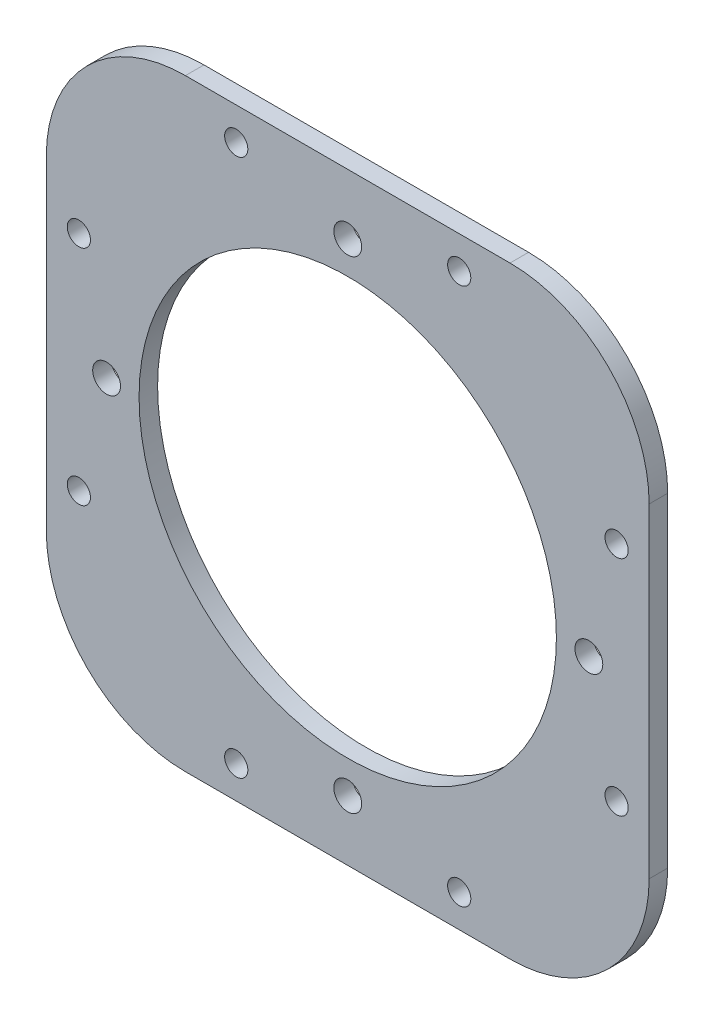
ISO-10303-21;
HEADER;
FILE_DESCRIPTION(('STEP AP214'),'2;1');
FILE_NAME('part.step','',(''),(''),'','','');
FILE_SCHEMA(('AUTOMOTIVE_DESIGN { 1 0 10303 214 1 1 1 1 }'));
ENDSEC;
DATA;
#1=APPLICATION_CONTEXT('core data for automotive mechanical design processes');
#2=APPLICATION_PROTOCOL_DEFINITION('international standard','automotive_design',2000,#1);
#3=PRODUCT_CONTEXT('',#1,'mechanical');
#4=PRODUCT('Part','Part','',(#3));
#5=PRODUCT_RELATED_PRODUCT_CATEGORY('part','',(#4));
#6=PRODUCT_DEFINITION_FORMATION('','',#4);
#7=PRODUCT_DEFINITION_CONTEXT('part definition',#1,'design');
#8=PRODUCT_DEFINITION('design','',#6,#7);
#9=PRODUCT_DEFINITION_SHAPE('','',#8);
#10=(LENGTH_UNIT() NAMED_UNIT(*) SI_UNIT(.MILLI.,.METRE.));
#11=(NAMED_UNIT(*) PLANE_ANGLE_UNIT() SI_UNIT($,.RADIAN.));
#12=(NAMED_UNIT(*) SI_UNIT($,.STERADIAN.) SOLID_ANGLE_UNIT());
#13=UNCERTAINTY_MEASURE_WITH_UNIT(LENGTH_MEASURE(1.E-05),#10,'distance_accuracy_value','');
#14=(GEOMETRIC_REPRESENTATION_CONTEXT(3) GLOBAL_UNCERTAINTY_ASSIGNED_CONTEXT((#13)) GLOBAL_UNIT_ASSIGNED_CONTEXT((#10,
#11,#12)) REPRESENTATION_CONTEXT('',''));
#15=CARTESIAN_POINT('',(0.,0.,0.));
#16=DIRECTION('',(0.,0.,1.));
#17=DIRECTION('',(1.,0.,0.));
#18=AXIS2_PLACEMENT_3D('',#15,#16,#17);
#19=CARTESIAN_POINT('',(0.,0.,2.));
#20=DIRECTION('',(0.,0.,1.));
#21=DIRECTION('',(1.,0.,0.));
#22=AXIS2_PLACEMENT_3D('',#19,#20,#21);
#23=PLANE('',#22);
#24=CARTESIAN_POINT('',(-28.9913780286489,12.0208152801702,2.));
#25=DIRECTION('',(0.,0.,1.));
#26=DIRECTION('',(1.,0.,0.));
#27=AXIS2_PLACEMENT_3D('',#24,#25,#26);
#28=CIRCLE('',#27,1.25000000000119);
#29=CARTESIAN_POINT('',(-27.7413780286477,12.0208152801702,2.));
#30=VERTEX_POINT('',#29);
#31=EDGE_CURVE('E244',#30,#30,#28,.T.);
#32=ORIENTED_EDGE('',*,*,#31,.F.);
#33=EDGE_LOOP('',(#32));
#34=FACE_BOUND('',#33,.T.);
#35=CARTESIAN_POINT('',(-12.0208152801707,-28.9913780286501,2.));
#36=DIRECTION('',(0.,0.,1.));
#37=DIRECTION('',(1.,0.,0.));
#38=AXIS2_PLACEMENT_3D('',#35,#36,#37);
#39=CIRCLE('',#38,1.25000000000031);
#40=CARTESIAN_POINT('',(-10.7708152801703,-28.9913780286501,2.));
#41=VERTEX_POINT('',#40);
#42=EDGE_CURVE('E232',#41,#41,#39,.T.);
#43=ORIENTED_EDGE('',*,*,#42,.F.);
#44=EDGE_LOOP('',(#43));
#45=FACE_BOUND('',#44,.T.);
#46=CARTESIAN_POINT('',(28.9913780286496,-12.0208152801718,2.));
#47=DIRECTION('',(0.,0.,1.));
#48=DIRECTION('',(1.,0.,0.));
#49=AXIS2_PLACEMENT_3D('',#46,#47,#48);
#50=CIRCLE('',#49,1.24999999999928);
#51=CARTESIAN_POINT('',(30.2413780286489,-12.0208152801718,2.));
#52=VERTEX_POINT('',#51);
#53=EDGE_CURVE('E220',#52,#52,#50,.T.);
#54=ORIENTED_EDGE('',*,*,#53,.F.);
#55=EDGE_LOOP('',(#54));
#56=FACE_BOUND('',#55,.T.);
#57=CARTESIAN_POINT('',(12.0208152801713,28.9913780286484,2.));
#58=DIRECTION('',(0.,0.,1.));
#59=DIRECTION('',(1.,0.,0.));
#60=AXIS2_PLACEMENT_3D('',#57,#58,#59);
#61=CIRCLE('',#60,1.25);
#62=CARTESIAN_POINT('',(13.2708152801713,28.9913780286484,2.));
#63=VERTEX_POINT('',#62);
#64=EDGE_CURVE('E208',#63,#63,#61,.T.);
#65=ORIENTED_EDGE('',*,*,#64,.F.);
#66=EDGE_LOOP('',(#65));
#67=FACE_BOUND('',#66,.T.);
#68=CARTESIAN_POINT('',(1.21956773276677E-12,-26.,2.));
#69=DIRECTION('',(0.,0.,1.));
#70=DIRECTION('',(1.,0.,0.));
#71=AXIS2_PLACEMENT_3D('',#68,#69,#70);
#72=CIRCLE('',#71,1.5);
#73=CARTESIAN_POINT('',(1.50000000000122,-26.,2.));
#74=VERTEX_POINT('',#73);
#75=EDGE_CURVE('E196',#74,#74,#72,.T.);
#76=ORIENTED_EDGE('',*,*,#75,.F.);
#77=EDGE_LOOP('',(#76));
#78=FACE_BOUND('',#77,.T.);
#79=CARTESIAN_POINT('',(0.,26.,2.));
#80=DIRECTION('',(0.,0.,1.));
#81=DIRECTION('',(1.,0.,0.));
#82=AXIS2_PLACEMENT_3D('',#79,#80,#81);
#83=CIRCLE('',#82,1.5);
#84=CARTESIAN_POINT('',(1.49999999999998,26.,2.));
#85=VERTEX_POINT('',#84);
#86=EDGE_CURVE('E185',#85,#85,#83,.T.);
#87=ORIENTED_EDGE('',*,*,#86,.F.);
#88=EDGE_LOOP('',(#87));
#89=FACE_BOUND('',#88,.T.);
#90=DIRECTION('',(1.,0.,0.));
#91=VECTOR('',#90,1.);
#92=CARTESIAN_POINT('',(32.5,-32.5,2.));
#93=LINE('',#92,#91);
#94=CARTESIAN_POINT('',(-17.5,-32.5,2.));
#95=VERTEX_POINT('',#94);
#96=CARTESIAN_POINT('',(17.5,-32.5,2.));
#97=VERTEX_POINT('',#96);
#98=EDGE_CURVE('E170',#95,#97,#93,.T.);
#99=ORIENTED_EDGE('',*,*,#98,.T.);
#100=CARTESIAN_POINT('',(17.5,-17.5,2.));
#101=DIRECTION('',(0.,0.,1.));
#102=DIRECTION('',(1.,0.,0.));
#103=AXIS2_PLACEMENT_3D('',#100,#101,#102);
#104=CIRCLE('',#103,15.);
#105=CARTESIAN_POINT('',(32.5,-17.5,2.));
#106=VERTEX_POINT('',#105);
#107=EDGE_CURVE('E150',#97,#106,#104,.T.);
#108=ORIENTED_EDGE('',*,*,#107,.T.);
#109=DIRECTION('',(0.,1.,0.));
#110=VECTOR('',#109,1.);
#111=CARTESIAN_POINT('',(32.5,-32.5,2.));
#112=LINE('',#111,#110);
#113=CARTESIAN_POINT('',(32.5,17.5,2.));
#114=VERTEX_POINT('',#113);
#115=EDGE_CURVE('E120',#106,#114,#112,.T.);
#116=ORIENTED_EDGE('',*,*,#115,.T.);
#117=CARTESIAN_POINT('',(17.5,17.5,2.));
#118=DIRECTION('',(0.,0.,1.));
#119=DIRECTION('',(1.,0.,0.));
#120=AXIS2_PLACEMENT_3D('',#117,#118,#119);
#121=CIRCLE('',#120,15.);
#122=CARTESIAN_POINT('',(17.5,32.5,2.));
#123=VERTEX_POINT('',#122);
#124=EDGE_CURVE('E56',#114,#123,#121,.T.);
#125=ORIENTED_EDGE('',*,*,#124,.T.);
#126=DIRECTION('',(-1.,0.,0.));
#127=VECTOR('',#126,1.);
#128=CARTESIAN_POINT('',(32.5,32.5,2.));
#129=LINE('',#128,#127);
#130=CARTESIAN_POINT('',(-17.5,32.5,2.));
#131=VERTEX_POINT('',#130);
#132=EDGE_CURVE('E137',#123,#131,#129,.T.);
#133=ORIENTED_EDGE('',*,*,#132,.T.);
#134=CARTESIAN_POINT('',(-17.5,17.5,2.));
#135=DIRECTION('',(0.,0.,1.));
#136=DIRECTION('',(1.,0.,0.));
#137=AXIS2_PLACEMENT_3D('',#134,#135,#136);
#138=CIRCLE('',#137,15.);
#139=CARTESIAN_POINT('',(-32.5,17.5,2.));
#140=VERTEX_POINT('',#139);
#141=EDGE_CURVE('E145',#131,#140,#138,.T.);
#142=ORIENTED_EDGE('',*,*,#141,.T.);
#143=DIRECTION('',(0.,-1.,0.));
#144=VECTOR('',#143,1.);
#145=CARTESIAN_POINT('',(-32.5,-32.5,2.));
#146=LINE('',#145,#144);
#147=CARTESIAN_POINT('',(-32.5,-17.5,2.));
#148=VERTEX_POINT('',#147);
#149=EDGE_CURVE('E131',#140,#148,#146,.T.);
#150=ORIENTED_EDGE('',*,*,#149,.T.);
#151=CARTESIAN_POINT('',(-17.5,-17.5,2.));
#152=DIRECTION('',(0.,0.,1.));
#153=DIRECTION('',(1.,0.,0.));
#154=AXIS2_PLACEMENT_3D('',#151,#152,#153);
#155=CIRCLE('',#154,15.);
#156=EDGE_CURVE('E148',#148,#95,#155,.T.);
#157=ORIENTED_EDGE('',*,*,#156,.T.);
#158=EDGE_LOOP('',(#99,#108,#116,#125,#133,#142,#150,#157));
#159=FACE_BOUND('',#158,.T.);
#160=CARTESIAN_POINT('',(0.,0.,2.));
#161=DIRECTION('',(0.,0.,1.));
#162=DIRECTION('',(1.,0.,0.));
#163=AXIS2_PLACEMENT_3D('',#160,#161,#162);
#164=CIRCLE('',#163,22.5);
#165=CARTESIAN_POINT('',(22.5,0.,2.));
#166=VERTEX_POINT('',#165);
#167=EDGE_CURVE('E176',#166,#166,#164,.T.);
#168=ORIENTED_EDGE('',*,*,#167,.F.);
#169=EDGE_LOOP('',(#168));
#170=FACE_BOUND('',#169,.T.);
#171=CARTESIAN_POINT('',(26.0000000000006,6.19949510421736E-13,2.));
#172=DIRECTION('',(0.,0.,1.));
#173=DIRECTION('',(1.,0.,0.));
#174=AXIS2_PLACEMENT_3D('',#171,#172,#173);
#175=CIRCLE('',#174,1.5);
#176=CARTESIAN_POINT('',(27.5000000000006,6.19949510421736E-13,2.));
#177=VERTEX_POINT('',#176);
#178=EDGE_CURVE('E190',#177,#177,#175,.T.);
#179=ORIENTED_EDGE('',*,*,#178,.F.);
#180=EDGE_LOOP('',(#179));
#181=FACE_BOUND('',#180,.T.);
#182=CARTESIAN_POINT('',(-25.9999999999994,-6.23133592099519E-13,2.));
#183=DIRECTION('',(0.,0.,1.));
#184=DIRECTION('',(1.,0.,0.));
#185=AXIS2_PLACEMENT_3D('',#182,#183,#184);
#186=CIRCLE('',#185,1.5);
#187=CARTESIAN_POINT('',(-24.4999999999994,-6.23133592099519E-13,2.));
#188=VERTEX_POINT('',#187);
#189=EDGE_CURVE('E202',#188,#188,#186,.T.);
#190=ORIENTED_EDGE('',*,*,#189,.F.);
#191=EDGE_LOOP('',(#190));
#192=FACE_BOUND('',#191,.T.);
#193=CARTESIAN_POINT('',(28.9913780286485,12.0208152801713,2.));
#194=DIRECTION('',(0.,0.,1.));
#195=DIRECTION('',(-1.,0.,0.));
#196=AXIS2_PLACEMENT_3D('',#193,#194,#195);
#197=CIRCLE('',#196,1.24999999999999);
#198=CARTESIAN_POINT('',(27.7413780286485,12.0208152801713,2.));
#199=VERTEX_POINT('',#198);
#200=EDGE_CURVE('E214',#199,#199,#197,.T.);
#201=ORIENTED_EDGE('',*,*,#200,.F.);
#202=EDGE_LOOP('',(#201));
#203=FACE_BOUND('',#202,.T.);
#204=CARTESIAN_POINT('',(12.0208152801724,-28.9913780286489,2.));
#205=DIRECTION('',(0.,0.,1.));
#206=DIRECTION('',(-1.,0.,0.));
#207=AXIS2_PLACEMENT_3D('',#204,#205,#206);
#208=CIRCLE('',#207,1.24999999999869);
#209=CARTESIAN_POINT('',(10.7708152801738,-28.9913780286489,2.));
#210=VERTEX_POINT('',#209);
#211=EDGE_CURVE('E226',#210,#210,#208,.T.);
#212=ORIENTED_EDGE('',*,*,#211,.F.);
#213=EDGE_LOOP('',(#212));
#214=FACE_BOUND('',#213,.T.);
#215=CARTESIAN_POINT('',(-28.9913780286478,-12.0208152801729,2.));
#216=DIRECTION('',(0.,0.,1.));
#217=DIRECTION('',(-1.,0.,0.));
#218=AXIS2_PLACEMENT_3D('',#215,#216,#217);
#219=CIRCLE('',#218,1.24999999999846);
#220=CARTESIAN_POINT('',(-30.2413780286463,-12.0208152801729,2.));
#221=VERTEX_POINT('',#220);
#222=EDGE_CURVE('E238',#221,#221,#219,.T.);
#223=ORIENTED_EDGE('',*,*,#222,.F.);
#224=EDGE_LOOP('',(#223));
#225=FACE_BOUND('',#224,.T.);
#226=CARTESIAN_POINT('',(-12.0208152801718,28.9913780286473,2.));
#227=DIRECTION('',(0.,0.,1.));
#228=DIRECTION('',(-1.,0.,0.));
#229=AXIS2_PLACEMENT_3D('',#226,#227,#228);
#230=CIRCLE('',#229,1.24999999999961);
#231=CARTESIAN_POINT('',(-13.2708152801714,28.9913780286473,2.));
#232=VERTEX_POINT('',#231);
#233=EDGE_CURVE('E250',#232,#232,#230,.T.);
#234=ORIENTED_EDGE('',*,*,#233,.F.);
#235=EDGE_LOOP('',(#234));
#236=FACE_BOUND('',#235,.T.);
#237=ADVANCED_FACE('F35',(#34,#45,#56,#67,#78,#89,#159,#170,#181,#192,#203,#214,#225,#236),#23,.T.);
#238=CARTESIAN_POINT('',(0.,0.,0.));
#239=DIRECTION('',(0.,0.,1.));
#240=DIRECTION('',(1.,0.,0.));
#241=AXIS2_PLACEMENT_3D('',#238,#239,#240);
#242=PLANE('',#241);
#243=DIRECTION('',(0.,1.,0.));
#244=VECTOR('',#243,1.);
#245=CARTESIAN_POINT('',(32.5,-32.5,0.));
#246=LINE('',#245,#244);
#247=CARTESIAN_POINT('',(32.5,-17.5,0.));
#248=VERTEX_POINT('',#247);
#249=CARTESIAN_POINT('',(32.5,17.5,0.));
#250=VERTEX_POINT('',#249);
#251=EDGE_CURVE('E118',#248,#250,#246,.T.);
#252=ORIENTED_EDGE('',*,*,#251,.F.);
#253=CARTESIAN_POINT('',(17.5,-17.5,0.));
#254=DIRECTION('',(0.,0.,1.));
#255=DIRECTION('',(1.,0.,0.));
#256=AXIS2_PLACEMENT_3D('',#253,#254,#255);
#257=CIRCLE('',#256,15.);
#258=CARTESIAN_POINT('',(17.5,-32.5,0.));
#259=VERTEX_POINT('',#258);
#260=EDGE_CURVE('E101',#248,#259,#257,.F.);
#261=ORIENTED_EDGE('',*,*,#260,.T.);
#262=DIRECTION('',(1.,0.,0.));
#263=VECTOR('',#262,1.);
#264=CARTESIAN_POINT('',(32.5,-32.5,0.));
#265=LINE('',#264,#263);
#266=CARTESIAN_POINT('',(-17.5,-32.5,0.));
#267=VERTEX_POINT('',#266);
#268=EDGE_CURVE('E129',#267,#259,#265,.T.);
#269=ORIENTED_EDGE('',*,*,#268,.F.);
#270=CARTESIAN_POINT('',(-17.5,-17.5,0.));
#271=DIRECTION('',(0.,0.,1.));
#272=DIRECTION('',(1.,0.,0.));
#273=AXIS2_PLACEMENT_3D('',#270,#271,#272);
#274=CIRCLE('',#273,15.);
#275=CARTESIAN_POINT('',(-32.5,-17.5,0.));
#276=VERTEX_POINT('',#275);
#277=EDGE_CURVE('E112',#267,#276,#274,.F.);
#278=ORIENTED_EDGE('',*,*,#277,.T.);
#279=DIRECTION('',(0.,-1.,0.));
#280=VECTOR('',#279,1.);
#281=CARTESIAN_POINT('',(-32.5,-32.5,0.));
#282=LINE('',#281,#280);
#283=CARTESIAN_POINT('',(-32.5,17.5,0.));
#284=VERTEX_POINT('',#283);
#285=EDGE_CURVE('E133',#284,#276,#282,.T.);
#286=ORIENTED_EDGE('',*,*,#285,.F.);
#287=CARTESIAN_POINT('',(-17.5,17.5,0.));
#288=DIRECTION('',(0.,0.,1.));
#289=DIRECTION('',(1.,0.,0.));
#290=AXIS2_PLACEMENT_3D('',#287,#288,#289);
#291=CIRCLE('',#290,15.);
#292=CARTESIAN_POINT('',(-17.5,32.5,0.));
#293=VERTEX_POINT('',#292);
#294=EDGE_CURVE('E121',#284,#293,#291,.F.);
#295=ORIENTED_EDGE('',*,*,#294,.T.);
#296=DIRECTION('',(-1.,0.,0.));
#297=VECTOR('',#296,1.);
#298=CARTESIAN_POINT('',(32.5,32.5,0.));
#299=LINE('',#298,#297);
#300=CARTESIAN_POINT('',(17.5,32.5,0.));
#301=VERTEX_POINT('',#300);
#302=EDGE_CURVE('E128',#301,#293,#299,.T.);
#303=ORIENTED_EDGE('',*,*,#302,.F.);
#304=CARTESIAN_POINT('',(17.5,17.5,0.));
#305=DIRECTION('',(0.,0.,1.));
#306=DIRECTION('',(1.,0.,0.));
#307=AXIS2_PLACEMENT_3D('',#304,#305,#306);
#308=CIRCLE('',#307,15.);
#309=EDGE_CURVE('E127',#301,#250,#308,.F.);
#310=ORIENTED_EDGE('',*,*,#309,.T.);
#311=EDGE_LOOP('',(#252,#261,#269,#278,#286,#295,#303,#310));
#312=FACE_BOUND('',#311,.T.);
#313=CARTESIAN_POINT('',(0.,0.,0.));
#314=DIRECTION('',(0.,0.,1.));
#315=DIRECTION('',(1.,0.,0.));
#316=AXIS2_PLACEMENT_3D('',#313,#314,#315);
#317=CIRCLE('',#316,22.5);
#318=CARTESIAN_POINT('',(22.5,0.,0.));
#319=VERTEX_POINT('',#318);
#320=EDGE_CURVE('E178',#319,#319,#317,.T.);
#321=ORIENTED_EDGE('',*,*,#320,.T.);
#322=EDGE_LOOP('',(#321));
#323=FACE_BOUND('',#322,.T.);
#324=CARTESIAN_POINT('',(0.,26.,0.));
#325=DIRECTION('',(0.,0.,1.));
#326=DIRECTION('',(1.,0.,0.));
#327=AXIS2_PLACEMENT_3D('',#324,#325,#326);
#328=CIRCLE('',#327,1.5);
#329=CARTESIAN_POINT('',(1.49999999999998,26.,0.));
#330=VERTEX_POINT('',#329);
#331=EDGE_CURVE('E187',#330,#330,#328,.T.);
#332=ORIENTED_EDGE('',*,*,#331,.T.);
#333=EDGE_LOOP('',(#332));
#334=FACE_BOUND('',#333,.T.);
#335=CARTESIAN_POINT('',(26.0000000000006,6.19949510421736E-13,0.));
#336=DIRECTION('',(0.,0.,1.));
#337=DIRECTION('',(1.,0.,0.));
#338=AXIS2_PLACEMENT_3D('',#335,#336,#337);
#339=CIRCLE('',#338,1.5);
#340=CARTESIAN_POINT('',(27.5000000000006,6.19949510421736E-13,0.));
#341=VERTEX_POINT('',#340);
#342=EDGE_CURVE('E193',#341,#341,#339,.T.);
#343=ORIENTED_EDGE('',*,*,#342,.T.);
#344=EDGE_LOOP('',(#343));
#345=FACE_BOUND('',#344,.T.);
#346=CARTESIAN_POINT('',(1.21956773276677E-12,-26.,0.));
#347=DIRECTION('',(0.,0.,1.));
#348=DIRECTION('',(1.,0.,0.));
#349=AXIS2_PLACEMENT_3D('',#346,#347,#348);
#350=CIRCLE('',#349,1.5);
#351=CARTESIAN_POINT('',(1.50000000000122,-26.,0.));
#352=VERTEX_POINT('',#351);
#353=EDGE_CURVE('E199',#352,#352,#350,.T.);
#354=ORIENTED_EDGE('',*,*,#353,.T.);
#355=EDGE_LOOP('',(#354));
#356=FACE_BOUND('',#355,.T.);
#357=CARTESIAN_POINT('',(-25.9999999999994,-6.23133592099519E-13,0.));
#358=DIRECTION('',(0.,0.,1.));
#359=DIRECTION('',(1.,0.,0.));
#360=AXIS2_PLACEMENT_3D('',#357,#358,#359);
#361=CIRCLE('',#360,1.5);
#362=CARTESIAN_POINT('',(-24.4999999999994,-6.23133592099519E-13,0.));
#363=VERTEX_POINT('',#362);
#364=EDGE_CURVE('E205',#363,#363,#361,.T.);
#365=ORIENTED_EDGE('',*,*,#364,.T.);
#366=EDGE_LOOP('',(#365));
#367=FACE_BOUND('',#366,.T.);
#368=CARTESIAN_POINT('',(12.0208152801713,28.9913780286484,0.));
#369=DIRECTION('',(0.,0.,1.));
#370=DIRECTION('',(1.,0.,0.));
#371=AXIS2_PLACEMENT_3D('',#368,#369,#370);
#372=CIRCLE('',#371,1.25);
#373=CARTESIAN_POINT('',(13.2708152801713,28.9913780286484,0.));
#374=VERTEX_POINT('',#373);
#375=EDGE_CURVE('E211',#374,#374,#372,.T.);
#376=ORIENTED_EDGE('',*,*,#375,.T.);
#377=EDGE_LOOP('',(#376));
#378=FACE_BOUND('',#377,.T.);
#379=CARTESIAN_POINT('',(28.9913780286485,12.0208152801713,0.));
#380=DIRECTION('',(0.,0.,1.));
#381=DIRECTION('',(-1.,0.,0.));
#382=AXIS2_PLACEMENT_3D('',#379,#380,#381);
#383=CIRCLE('',#382,1.24999999999999);
#384=CARTESIAN_POINT('',(27.7413780286485,12.0208152801713,0.));
#385=VERTEX_POINT('',#384);
#386=EDGE_CURVE('E217',#385,#385,#383,.T.);
#387=ORIENTED_EDGE('',*,*,#386,.T.);
#388=EDGE_LOOP('',(#387));
#389=FACE_BOUND('',#388,.T.);
#390=CARTESIAN_POINT('',(28.9913780286496,-12.0208152801718,0.));
#391=DIRECTION('',(0.,0.,1.));
#392=DIRECTION('',(1.,0.,0.));
#393=AXIS2_PLACEMENT_3D('',#390,#391,#392);
#394=CIRCLE('',#393,1.24999999999928);
#395=CARTESIAN_POINT('',(30.2413780286489,-12.0208152801718,0.));
#396=VERTEX_POINT('',#395);
#397=EDGE_CURVE('E223',#396,#396,#394,.T.);
#398=ORIENTED_EDGE('',*,*,#397,.T.);
#399=EDGE_LOOP('',(#398));
#400=FACE_BOUND('',#399,.T.);
#401=CARTESIAN_POINT('',(12.0208152801724,-28.9913780286489,0.));
#402=DIRECTION('',(0.,0.,1.));
#403=DIRECTION('',(-1.,0.,0.));
#404=AXIS2_PLACEMENT_3D('',#401,#402,#403);
#405=CIRCLE('',#404,1.24999999999869);
#406=CARTESIAN_POINT('',(10.7708152801738,-28.9913780286489,0.));
#407=VERTEX_POINT('',#406);
#408=EDGE_CURVE('E229',#407,#407,#405,.T.);
#409=ORIENTED_EDGE('',*,*,#408,.T.);
#410=EDGE_LOOP('',(#409));
#411=FACE_BOUND('',#410,.T.);
#412=CARTESIAN_POINT('',(-12.0208152801707,-28.9913780286501,0.));
#413=DIRECTION('',(0.,0.,1.));
#414=DIRECTION('',(1.,0.,0.));
#415=AXIS2_PLACEMENT_3D('',#412,#413,#414);
#416=CIRCLE('',#415,1.25000000000031);
#417=CARTESIAN_POINT('',(-10.7708152801703,-28.9913780286501,0.));
#418=VERTEX_POINT('',#417);
#419=EDGE_CURVE('E235',#418,#418,#416,.T.);
#420=ORIENTED_EDGE('',*,*,#419,.T.);
#421=EDGE_LOOP('',(#420));
#422=FACE_BOUND('',#421,.T.);
#423=CARTESIAN_POINT('',(-28.9913780286478,-12.0208152801729,0.));
#424=DIRECTION('',(0.,0.,1.));
#425=DIRECTION('',(-1.,0.,0.));
#426=AXIS2_PLACEMENT_3D('',#423,#424,#425);
#427=CIRCLE('',#426,1.24999999999846);
#428=CARTESIAN_POINT('',(-30.2413780286463,-12.0208152801729,0.));
#429=VERTEX_POINT('',#428);
#430=EDGE_CURVE('E241',#429,#429,#427,.T.);
#431=ORIENTED_EDGE('',*,*,#430,.T.);
#432=EDGE_LOOP('',(#431));
#433=FACE_BOUND('',#432,.T.);
#434=CARTESIAN_POINT('',(-28.9913780286489,12.0208152801702,0.));
#435=DIRECTION('',(0.,0.,1.));
#436=DIRECTION('',(1.,0.,0.));
#437=AXIS2_PLACEMENT_3D('',#434,#435,#436);
#438=CIRCLE('',#437,1.25000000000119);
#439=CARTESIAN_POINT('',(-27.7413780286477,12.0208152801702,0.));
#440=VERTEX_POINT('',#439);
#441=EDGE_CURVE('E247',#440,#440,#438,.T.);
#442=ORIENTED_EDGE('',*,*,#441,.T.);
#443=EDGE_LOOP('',(#442));
#444=FACE_BOUND('',#443,.T.);
#445=CARTESIAN_POINT('',(-12.0208152801718,28.9913780286473,0.));
#446=DIRECTION('',(0.,0.,1.));
#447=DIRECTION('',(-1.,0.,0.));
#448=AXIS2_PLACEMENT_3D('',#445,#446,#447);
#449=CIRCLE('',#448,1.24999999999961);
#450=CARTESIAN_POINT('',(-13.2708152801714,28.9913780286473,0.));
#451=VERTEX_POINT('',#450);
#452=EDGE_CURVE('E253',#451,#451,#449,.T.);
#453=ORIENTED_EDGE('',*,*,#452,.T.);
#454=EDGE_LOOP('',(#453));
#455=FACE_BOUND('',#454,.T.);
#456=ADVANCED_FACE('F124',(#312,#323,#334,#345,#356,#367,#378,#389,#400,#411,#422,#433,#444,
#455),#242,.F.);
#457=CARTESIAN_POINT('',(-32.5,-32.5,2.));
#458=DIRECTION('',(1.,0.,0.));
#459=DIRECTION('',(0.,0.,-1.));
#460=AXIS2_PLACEMENT_3D('',#457,#458,#459);
#461=PLANE('',#460);
#462=ORIENTED_EDGE('',*,*,#285,.T.);
#463=DIRECTION('',(0.,0.,-1.));
#464=VECTOR('',#463,1.);
#465=CARTESIAN_POINT('',(-32.5,-17.5,2.));
#466=LINE('',#465,#464);
#467=EDGE_CURVE('E155',#276,#148,#466,.F.);
#468=ORIENTED_EDGE('',*,*,#467,.T.);
#469=ORIENTED_EDGE('',*,*,#149,.F.);
#470=DIRECTION('',(0.,0.,-1.));
#471=VECTOR('',#470,1.);
#472=CARTESIAN_POINT('',(-32.5,17.5,2.));
#473=LINE('',#472,#471);
#474=EDGE_CURVE('E152',#140,#284,#473,.T.);
#475=ORIENTED_EDGE('',*,*,#474,.T.);
#476=EDGE_LOOP('',(#462,#468,#469,#475));
#477=FACE_BOUND('',#476,.T.);
#478=ADVANCED_FACE('F161',(#477),#461,.F.);
#479=CARTESIAN_POINT('',(32.5,-32.5,2.));
#480=DIRECTION('',(0.,1.,0.));
#481=DIRECTION('',(-1.,0.,0.));
#482=AXIS2_PLACEMENT_3D('',#479,#480,#481);
#483=PLANE('',#482);
#484=ORIENTED_EDGE('',*,*,#268,.T.);
#485=DIRECTION('',(0.,0.,-1.));
#486=VECTOR('',#485,1.);
#487=CARTESIAN_POINT('',(17.5,-32.5,2.));
#488=LINE('',#487,#486);
#489=EDGE_CURVE('E106',#259,#97,#488,.F.);
#490=ORIENTED_EDGE('',*,*,#489,.T.);
#491=ORIENTED_EDGE('',*,*,#98,.F.);
#492=DIRECTION('',(0.,0.,-1.));
#493=VECTOR('',#492,1.);
#494=CARTESIAN_POINT('',(-17.5,-32.5,2.));
#495=LINE('',#494,#493);
#496=EDGE_CURVE('E111',#95,#267,#495,.T.);
#497=ORIENTED_EDGE('',*,*,#496,.T.);
#498=EDGE_LOOP('',(#484,#490,#491,#497));
#499=FACE_BOUND('',#498,.T.);
#500=ADVANCED_FACE('F175',(#499),#483,.F.);
#501=CARTESIAN_POINT('',(32.5,-32.5,2.));
#502=DIRECTION('',(-1.,0.,0.));
#503=DIRECTION('',(0.,0.,1.));
#504=AXIS2_PLACEMENT_3D('',#501,#502,#503);
#505=PLANE('',#504);
#506=ORIENTED_EDGE('',*,*,#115,.F.);
#507=DIRECTION('',(0.,0.,-1.));
#508=VECTOR('',#507,1.);
#509=CARTESIAN_POINT('',(32.5,-17.5,2.));
#510=LINE('',#509,#508);
#511=EDGE_CURVE('E105',#106,#248,#510,.T.);
#512=ORIENTED_EDGE('',*,*,#511,.T.);
#513=ORIENTED_EDGE('',*,*,#251,.T.);
#514=DIRECTION('',(0.,0.,-1.));
#515=VECTOR('',#514,1.);
#516=CARTESIAN_POINT('',(32.5,17.5,2.));
#517=LINE('',#516,#515);
#518=EDGE_CURVE('E122',#250,#114,#517,.F.);
#519=ORIENTED_EDGE('',*,*,#518,.T.);
#520=EDGE_LOOP('',(#506,#512,#513,#519));
#521=FACE_BOUND('',#520,.T.);
#522=ADVANCED_FACE('F117',(#521),#505,.F.);
#523=CARTESIAN_POINT('',(32.5,32.5,2.));
#524=DIRECTION('',(0.,-1.,0.));
#525=DIRECTION('',(1.,0.,0.));
#526=AXIS2_PLACEMENT_3D('',#523,#524,#525);
#527=PLANE('',#526);
#528=ORIENTED_EDGE('',*,*,#132,.F.);
#529=DIRECTION('',(0.,0.,-1.));
#530=VECTOR('',#529,1.);
#531=CARTESIAN_POINT('',(17.5,32.5,2.));
#532=LINE('',#531,#530);
#533=EDGE_CURVE('E11',#123,#301,#532,.T.);
#534=ORIENTED_EDGE('',*,*,#533,.T.);
#535=ORIENTED_EDGE('',*,*,#302,.T.);
#536=DIRECTION('',(0.,0.,-1.));
#537=VECTOR('',#536,1.);
#538=CARTESIAN_POINT('',(-17.5,32.5,2.));
#539=LINE('',#538,#537);
#540=EDGE_CURVE('E43',#293,#131,#539,.F.);
#541=ORIENTED_EDGE('',*,*,#540,.T.);
#542=EDGE_LOOP('',(#528,#534,#535,#541));
#543=FACE_BOUND('',#542,.T.);
#544=ADVANCED_FACE('F275',(#543),#527,.F.);
#545=CARTESIAN_POINT('',(0.,0.,2.));
#546=DIRECTION('',(0.,0.,-1.));
#547=DIRECTION('',(-1.,0.,0.));
#548=AXIS2_PLACEMENT_3D('',#545,#546,#547);
#549=CYLINDRICAL_SURFACE('',#548,22.5);
#550=ORIENTED_EDGE('',*,*,#167,.T.);
#551=EDGE_LOOP('',(#550));
#552=FACE_BOUND('',#551,.T.);
#553=ORIENTED_EDGE('',*,*,#320,.F.);
#554=EDGE_LOOP('',(#553));
#555=FACE_BOUND('',#554,.T.);
#556=ADVANCED_FACE('F272',(#552,#555),#549,.F.);
#557=CARTESIAN_POINT('',(0.,26.,2.));
#558=DIRECTION('',(0.,0.,-1.));
#559=DIRECTION('',(-1.,0.,0.));
#560=AXIS2_PLACEMENT_3D('',#557,#558,#559);
#561=CYLINDRICAL_SURFACE('',#560,1.5);
#562=ORIENTED_EDGE('',*,*,#86,.T.);
#563=EDGE_LOOP('',(#562));
#564=FACE_BOUND('',#563,.T.);
#565=ORIENTED_EDGE('',*,*,#331,.F.);
#566=EDGE_LOOP('',(#565));
#567=FACE_BOUND('',#566,.T.);
#568=ADVANCED_FACE('F457',(#564,#567),#561,.F.);
#569=CARTESIAN_POINT('',(26.0000000000006,6.19949510421736E-13,2.));
#570=DIRECTION('',(0.,0.,-1.));
#571=DIRECTION('',(-1.,0.,0.));
#572=AXIS2_PLACEMENT_3D('',#569,#570,#571);
#573=CYLINDRICAL_SURFACE('',#572,1.5);
#574=ORIENTED_EDGE('',*,*,#178,.T.);
#575=EDGE_LOOP('',(#574));
#576=FACE_BOUND('',#575,.T.);
#577=ORIENTED_EDGE('',*,*,#342,.F.);
#578=EDGE_LOOP('',(#577));
#579=FACE_BOUND('',#578,.T.);
#580=ADVANCED_FACE('F447',(#576,#579),#573,.F.);
#581=CARTESIAN_POINT('',(1.21956773276677E-12,-26.,2.));
#582=DIRECTION('',(0.,0.,-1.));
#583=DIRECTION('',(-1.,0.,0.));
#584=AXIS2_PLACEMENT_3D('',#581,#582,#583);
#585=CYLINDRICAL_SURFACE('',#584,1.5);
#586=ORIENTED_EDGE('',*,*,#75,.T.);
#587=EDGE_LOOP('',(#586));
#588=FACE_BOUND('',#587,.T.);
#589=ORIENTED_EDGE('',*,*,#353,.F.);
#590=EDGE_LOOP('',(#589));
#591=FACE_BOUND('',#590,.T.);
#592=ADVANCED_FACE('F437',(#588,#591),#585,.F.);
#593=CARTESIAN_POINT('',(-25.9999999999994,-6.23133592099519E-13,2.));
#594=DIRECTION('',(0.,0.,-1.));
#595=DIRECTION('',(-1.,0.,0.));
#596=AXIS2_PLACEMENT_3D('',#593,#594,#595);
#597=CYLINDRICAL_SURFACE('',#596,1.5);
#598=ORIENTED_EDGE('',*,*,#189,.T.);
#599=EDGE_LOOP('',(#598));
#600=FACE_BOUND('',#599,.T.);
#601=ORIENTED_EDGE('',*,*,#364,.F.);
#602=EDGE_LOOP('',(#601));
#603=FACE_BOUND('',#602,.T.);
#604=ADVANCED_FACE('F427',(#600,#603),#597,.F.);
#605=CARTESIAN_POINT('',(12.0208152801713,28.9913780286484,2.));
#606=DIRECTION('',(0.,0.,-1.));
#607=DIRECTION('',(-1.,0.,0.));
#608=AXIS2_PLACEMENT_3D('',#605,#606,#607);
#609=CYLINDRICAL_SURFACE('',#608,1.25);
#610=ORIENTED_EDGE('',*,*,#64,.T.);
#611=EDGE_LOOP('',(#610));
#612=FACE_BOUND('',#611,.T.);
#613=ORIENTED_EDGE('',*,*,#375,.F.);
#614=EDGE_LOOP('',(#613));
#615=FACE_BOUND('',#614,.T.);
#616=ADVANCED_FACE('F417',(#612,#615),#609,.F.);
#617=CARTESIAN_POINT('',(28.9913780286485,12.0208152801713,2.));
#618=DIRECTION('',(0.,0.,-1.));
#619=DIRECTION('',(-1.,0.,0.));
#620=AXIS2_PLACEMENT_3D('',#617,#618,#619);
#621=CYLINDRICAL_SURFACE('',#620,1.24999999999999);
#622=ORIENTED_EDGE('',*,*,#200,.T.);
#623=EDGE_LOOP('',(#622));
#624=FACE_BOUND('',#623,.T.);
#625=ORIENTED_EDGE('',*,*,#386,.F.);
#626=EDGE_LOOP('',(#625));
#627=FACE_BOUND('',#626,.T.);
#628=ADVANCED_FACE('F407',(#624,#627),#621,.F.);
#629=CARTESIAN_POINT('',(28.9913780286496,-12.0208152801718,2.));
#630=DIRECTION('',(0.,0.,-1.));
#631=DIRECTION('',(-1.,0.,0.));
#632=AXIS2_PLACEMENT_3D('',#629,#630,#631);
#633=CYLINDRICAL_SURFACE('',#632,1.24999999999928);
#634=ORIENTED_EDGE('',*,*,#53,.T.);
#635=EDGE_LOOP('',(#634));
#636=FACE_BOUND('',#635,.T.);
#637=ORIENTED_EDGE('',*,*,#397,.F.);
#638=EDGE_LOOP('',(#637));
#639=FACE_BOUND('',#638,.T.);
#640=ADVANCED_FACE('F397',(#636,#639),#633,.F.);
#641=CARTESIAN_POINT('',(12.0208152801724,-28.9913780286489,2.));
#642=DIRECTION('',(0.,0.,-1.));
#643=DIRECTION('',(-1.,0.,0.));
#644=AXIS2_PLACEMENT_3D('',#641,#642,#643);
#645=CYLINDRICAL_SURFACE('',#644,1.24999999999869);
#646=ORIENTED_EDGE('',*,*,#211,.T.);
#647=EDGE_LOOP('',(#646));
#648=FACE_BOUND('',#647,.T.);
#649=ORIENTED_EDGE('',*,*,#408,.F.);
#650=EDGE_LOOP('',(#649));
#651=FACE_BOUND('',#650,.T.);
#652=ADVANCED_FACE('F387',(#648,#651),#645,.F.);
#653=CARTESIAN_POINT('',(-12.0208152801707,-28.9913780286501,2.));
#654=DIRECTION('',(0.,0.,-1.));
#655=DIRECTION('',(-1.,0.,0.));
#656=AXIS2_PLACEMENT_3D('',#653,#654,#655);
#657=CYLINDRICAL_SURFACE('',#656,1.25000000000031);
#658=ORIENTED_EDGE('',*,*,#42,.T.);
#659=EDGE_LOOP('',(#658));
#660=FACE_BOUND('',#659,.T.);
#661=ORIENTED_EDGE('',*,*,#419,.F.);
#662=EDGE_LOOP('',(#661));
#663=FACE_BOUND('',#662,.T.);
#664=ADVANCED_FACE('F377',(#660,#663),#657,.F.);
#665=CARTESIAN_POINT('',(-28.9913780286478,-12.0208152801729,2.));
#666=DIRECTION('',(0.,0.,-1.));
#667=DIRECTION('',(-1.,0.,0.));
#668=AXIS2_PLACEMENT_3D('',#665,#666,#667);
#669=CYLINDRICAL_SURFACE('',#668,1.24999999999846);
#670=ORIENTED_EDGE('',*,*,#222,.T.);
#671=EDGE_LOOP('',(#670));
#672=FACE_BOUND('',#671,.T.);
#673=ORIENTED_EDGE('',*,*,#430,.F.);
#674=EDGE_LOOP('',(#673));
#675=FACE_BOUND('',#674,.T.);
#676=ADVANCED_FACE('F367',(#672,#675),#669,.F.);
#677=CARTESIAN_POINT('',(-28.9913780286489,12.0208152801702,2.));
#678=DIRECTION('',(0.,0.,-1.));
#679=DIRECTION('',(-1.,0.,0.));
#680=AXIS2_PLACEMENT_3D('',#677,#678,#679);
#681=CYLINDRICAL_SURFACE('',#680,1.25000000000119);
#682=ORIENTED_EDGE('',*,*,#31,.T.);
#683=EDGE_LOOP('',(#682));
#684=FACE_BOUND('',#683,.T.);
#685=ORIENTED_EDGE('',*,*,#441,.F.);
#686=EDGE_LOOP('',(#685));
#687=FACE_BOUND('',#686,.T.);
#688=ADVANCED_FACE('F358',(#684,#687),#681,.F.);
#689=CARTESIAN_POINT('',(-12.0208152801718,28.9913780286473,2.));
#690=DIRECTION('',(0.,0.,-1.));
#691=DIRECTION('',(-1.,0.,0.));
#692=AXIS2_PLACEMENT_3D('',#689,#690,#691);
#693=CYLINDRICAL_SURFACE('',#692,1.24999999999961);
#694=ORIENTED_EDGE('',*,*,#233,.T.);
#695=EDGE_LOOP('',(#694));
#696=FACE_BOUND('',#695,.T.);
#697=ORIENTED_EDGE('',*,*,#452,.F.);
#698=EDGE_LOOP('',(#697));
#699=FACE_BOUND('',#698,.T.);
#700=ADVANCED_FACE('F259',(#696,#699),#693,.F.);
#701=CARTESIAN_POINT('',(17.5,-17.5,2.));
#702=DIRECTION('',(0.,0.,-1.));
#703=DIRECTION('',(-1.,0.,0.));
#704=AXIS2_PLACEMENT_3D('',#701,#702,#703);
#705=CYLINDRICAL_SURFACE('',#704,15.);
#706=ORIENTED_EDGE('',*,*,#107,.F.);
#707=ORIENTED_EDGE('',*,*,#489,.F.);
#708=ORIENTED_EDGE('',*,*,#260,.F.);
#709=ORIENTED_EDGE('',*,*,#511,.F.);
#710=EDGE_LOOP('',(#706,#707,#708,#709));
#711=FACE_BOUND('',#710,.T.);
#712=ADVANCED_FACE('F104',(#711),#705,.T.);
#713=CARTESIAN_POINT('',(-17.5,-17.5,2.));
#714=DIRECTION('',(0.,0.,-1.));
#715=DIRECTION('',(-1.,0.,0.));
#716=AXIS2_PLACEMENT_3D('',#713,#714,#715);
#717=CYLINDRICAL_SURFACE('',#716,15.);
#718=ORIENTED_EDGE('',*,*,#156,.F.);
#719=ORIENTED_EDGE('',*,*,#467,.F.);
#720=ORIENTED_EDGE('',*,*,#277,.F.);
#721=ORIENTED_EDGE('',*,*,#496,.F.);
#722=EDGE_LOOP('',(#718,#719,#720,#721));
#723=FACE_BOUND('',#722,.T.);
#724=ADVANCED_FACE('F173',(#723),#717,.T.);
#725=CARTESIAN_POINT('',(17.5,17.5,2.));
#726=DIRECTION('',(0.,0.,-1.));
#727=DIRECTION('',(-1.,0.,0.));
#728=AXIS2_PLACEMENT_3D('',#725,#726,#727);
#729=CYLINDRICAL_SURFACE('',#728,15.);
#730=ORIENTED_EDGE('',*,*,#124,.F.);
#731=ORIENTED_EDGE('',*,*,#518,.F.);
#732=ORIENTED_EDGE('',*,*,#309,.F.);
#733=ORIENTED_EDGE('',*,*,#533,.F.);
#734=EDGE_LOOP('',(#730,#731,#732,#733));
#735=FACE_BOUND('',#734,.T.);
#736=ADVANCED_FACE('F287',(#735),#729,.T.);
#737=CARTESIAN_POINT('',(-17.5,17.5,2.));
#738=DIRECTION('',(0.,0.,-1.));
#739=DIRECTION('',(-1.,0.,0.));
#740=AXIS2_PLACEMENT_3D('',#737,#738,#739);
#741=CYLINDRICAL_SURFACE('',#740,15.);
#742=ORIENTED_EDGE('',*,*,#141,.F.);
#743=ORIENTED_EDGE('',*,*,#540,.F.);
#744=ORIENTED_EDGE('',*,*,#294,.F.);
#745=ORIENTED_EDGE('',*,*,#474,.F.);
#746=EDGE_LOOP('',(#742,#743,#744,#745));
#747=FACE_BOUND('',#746,.T.);
#748=ADVANCED_FACE('F37',(#747),#741,.T.);
#749=CLOSED_SHELL('',(#237,#456,#478,#500,#522,#544,#556,#568,#580,#592,#604,#616,#628,#640,
#652,#664,#676,#688,#700,#712,#724,#736,#748));
#750=MANIFOLD_SOLID_BREP('B2',#749);
#751=ADVANCED_BREP_SHAPE_REPRESENTATION('',(#18,#750),#14);
#752=SHAPE_DEFINITION_REPRESENTATION(#9,#751);
ENDSEC;
END-ISO-10303-21;
